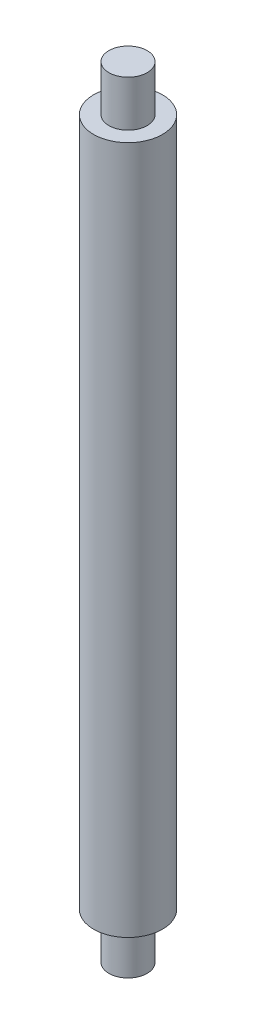
ISO-10303-21;
HEADER;
FILE_DESCRIPTION(('STEP AP214'),'2;1');
FILE_NAME('part.step','',(''),(''),'','','');
FILE_SCHEMA(('AUTOMOTIVE_DESIGN { 1 0 10303 214 1 1 1 1 }'));
ENDSEC;
DATA;
#1=APPLICATION_CONTEXT('core data for automotive mechanical design processes');
#2=APPLICATION_PROTOCOL_DEFINITION('international standard','automotive_design',2000,#1);
#3=PRODUCT_CONTEXT('',#1,'mechanical');
#4=PRODUCT('Part','Part','',(#3));
#5=PRODUCT_RELATED_PRODUCT_CATEGORY('part','',(#4));
#6=PRODUCT_DEFINITION_FORMATION('','',#4);
#7=PRODUCT_DEFINITION_CONTEXT('part definition',#1,'design');
#8=PRODUCT_DEFINITION('design','',#6,#7);
#9=PRODUCT_DEFINITION_SHAPE('','',#8);
#10=(LENGTH_UNIT() NAMED_UNIT(*) SI_UNIT(.MILLI.,.METRE.));
#11=(NAMED_UNIT(*) PLANE_ANGLE_UNIT() SI_UNIT($,.RADIAN.));
#12=(NAMED_UNIT(*) SI_UNIT($,.STERADIAN.) SOLID_ANGLE_UNIT());
#13=UNCERTAINTY_MEASURE_WITH_UNIT(LENGTH_MEASURE(1.E-05),#10,'distance_accuracy_value','');
#14=(GEOMETRIC_REPRESENTATION_CONTEXT(3) GLOBAL_UNCERTAINTY_ASSIGNED_CONTEXT((#13)) GLOBAL_UNIT_ASSIGNED_CONTEXT((#10,
#11,#12)) REPRESENTATION_CONTEXT('',''));
#15=CARTESIAN_POINT('',(0.,0.,0.));
#16=DIRECTION('',(0.,0.,1.));
#17=DIRECTION('',(1.,0.,0.));
#18=AXIS2_PLACEMENT_3D('',#15,#16,#17);
#19=CARTESIAN_POINT('',(0.,6.,0.));
#20=DIRECTION('',(0.,-1.,0.));
#21=DIRECTION('',(0.,0.,-1.));
#22=AXIS2_PLACEMENT_3D('',#19,#20,#21);
#23=CYLINDRICAL_SURFACE('',#22,2.5);
#24=CARTESIAN_POINT('',(0.,6.,0.));
#25=DIRECTION('',(0.,1.,0.));
#26=DIRECTION('',(0.,0.,1.));
#27=AXIS2_PLACEMENT_3D('',#24,#25,#26);
#28=CIRCLE('',#27,2.5);
#29=CARTESIAN_POINT('',(0.,6.,2.5));
#30=VERTEX_POINT('',#29);
#31=EDGE_CURVE('E38',#30,#30,#28,.T.);
#32=ORIENTED_EDGE('',*,*,#31,.F.);
#33=EDGE_LOOP('',(#32));
#34=FACE_BOUND('',#33,.T.);
#35=CARTESIAN_POINT('',(0.,0.,0.));
#36=DIRECTION('',(0.,1.,0.));
#37=DIRECTION('',(0.,0.,1.));
#38=AXIS2_PLACEMENT_3D('',#35,#36,#37);
#39=CIRCLE('',#38,2.5);
#40=CARTESIAN_POINT('',(0.,0.,2.5));
#41=VERTEX_POINT('',#40);
#42=EDGE_CURVE('E34',#41,#41,#39,.T.);
#43=ORIENTED_EDGE('',*,*,#42,.T.);
#44=EDGE_LOOP('',(#43));
#45=FACE_BOUND('',#44,.T.);
#46=ADVANCED_FACE('F31',(#34,#45),#23,.T.);
#47=CARTESIAN_POINT('',(0.,0.,0.));
#48=DIRECTION('',(0.,1.,0.));
#49=DIRECTION('',(0.,0.,1.));
#50=AXIS2_PLACEMENT_3D('',#47,#48,#49);
#51=PLANE('',#50);
#52=ORIENTED_EDGE('',*,*,#42,.F.);
#53=EDGE_LOOP('',(#52));
#54=FACE_BOUND('',#53,.T.);
#55=ADVANCED_FACE('F72',(#54),#51,.F.);
#56=CARTESIAN_POINT('',(0.,96.,0.));
#57=DIRECTION('',(0.,-1.,0.));
#58=DIRECTION('',(0.,0.,-1.));
#59=AXIS2_PLACEMENT_3D('',#56,#57,#58);
#60=CYLINDRICAL_SURFACE('',#59,4.5);
#61=CARTESIAN_POINT('',(0.,96.,0.));
#62=DIRECTION('',(0.,1.,0.));
#63=DIRECTION('',(0.,0.,1.));
#64=AXIS2_PLACEMENT_3D('',#61,#62,#63);
#65=CIRCLE('',#64,4.5);
#66=CARTESIAN_POINT('',(0.,96.,-4.5));
#67=VERTEX_POINT('',#66);
#68=EDGE_CURVE('E46',#67,#67,#65,.T.);
#69=CARTESIAN_POINT('',(0.,6.,0.));
#70=DIRECTION('',(0.,1.,0.));
#71=DIRECTION('',(0.,0.,1.));
#72=AXIS2_PLACEMENT_3D('',#69,#70,#71);
#73=CIRCLE('',#72,4.5);
#74=CARTESIAN_POINT('',(0.,5.99999999999999,-4.5));
#75=VERTEX_POINT('',#74);
#76=EDGE_CURVE('E49',#75,#75,#73,.T.);
#77=CARTESIAN_POINT('',(0.,96.,-4.5));
#78=CARTESIAN_POINT('',(0.,95.0625,-4.5));
#79=CARTESIAN_POINT('',(0.,94.125,-4.5));
#80=CARTESIAN_POINT('',(0.,92.25,-4.5));
#81=CARTESIAN_POINT('',(0.,91.3125,-4.5));
#82=CARTESIAN_POINT('',(0.,89.4375,-4.5));
#83=CARTESIAN_POINT('',(0.,88.5,-4.5));
#84=CARTESIAN_POINT('',(0.,86.625,-4.5));
#85=CARTESIAN_POINT('',(0.,85.6875,-4.5));
#86=CARTESIAN_POINT('',(0.,83.8125,-4.5));
#87=CARTESIAN_POINT('',(0.,82.875,-4.5));
#88=CARTESIAN_POINT('',(0.,81.,-4.5));
#89=CARTESIAN_POINT('',(0.,80.0625,-4.5));
#90=CARTESIAN_POINT('',(0.,78.1875,-4.5));
#91=CARTESIAN_POINT('',(0.,77.25,-4.5));
#92=CARTESIAN_POINT('',(0.,75.375,-4.5));
#93=CARTESIAN_POINT('',(0.,74.4375,-4.5));
#94=CARTESIAN_POINT('',(0.,72.5625,-4.5));
#95=CARTESIAN_POINT('',(0.,71.625,-4.5));
#96=CARTESIAN_POINT('',(0.,69.75,-4.5));
#97=CARTESIAN_POINT('',(0.,68.8125,-4.5));
#98=CARTESIAN_POINT('',(0.,66.9375,-4.5));
#99=CARTESIAN_POINT('',(0.,66.,-4.5));
#100=CARTESIAN_POINT('',(0.,64.125,-4.5));
#101=CARTESIAN_POINT('',(0.,63.1875,-4.5));
#102=CARTESIAN_POINT('',(0.,61.3125,-4.5));
#103=CARTESIAN_POINT('',(0.,60.375,-4.5));
#104=CARTESIAN_POINT('',(0.,58.5,-4.5));
#105=CARTESIAN_POINT('',(0.,57.5625,-4.5));
#106=CARTESIAN_POINT('',(0.,55.6875,-4.5));
#107=CARTESIAN_POINT('',(0.,54.75,-4.5));
#108=CARTESIAN_POINT('',(0.,52.875,-4.5));
#109=CARTESIAN_POINT('',(0.,51.9375,-4.5));
#110=CARTESIAN_POINT('',(0.,50.0625,-4.5));
#111=CARTESIAN_POINT('',(0.,49.125,-4.5));
#112=CARTESIAN_POINT('',(0.,47.25,-4.5));
#113=CARTESIAN_POINT('',(0.,46.3125,-4.5));
#114=CARTESIAN_POINT('',(0.,44.4375,-4.5));
#115=CARTESIAN_POINT('',(0.,43.5,-4.5));
#116=CARTESIAN_POINT('',(0.,41.625,-4.5));
#117=CARTESIAN_POINT('',(0.,40.6875,-4.5));
#118=CARTESIAN_POINT('',(0.,38.8125,-4.5));
#119=CARTESIAN_POINT('',(0.,37.875,-4.5));
#120=CARTESIAN_POINT('',(0.,36.,-4.5));
#121=CARTESIAN_POINT('',(0.,35.0625,-4.5));
#122=CARTESIAN_POINT('',(0.,33.1875,-4.5));
#123=CARTESIAN_POINT('',(0.,32.25,-4.5));
#124=CARTESIAN_POINT('',(0.,30.375,-4.5));
#125=CARTESIAN_POINT('',(0.,29.4375,-4.5));
#126=CARTESIAN_POINT('',(0.,27.5625,-4.5));
#127=CARTESIAN_POINT('',(0.,26.625,-4.5));
#128=CARTESIAN_POINT('',(0.,24.75,-4.5));
#129=CARTESIAN_POINT('',(0.,23.8125,-4.5));
#130=CARTESIAN_POINT('',(0.,21.9375,-4.5));
#131=CARTESIAN_POINT('',(0.,21.,-4.5));
#132=CARTESIAN_POINT('',(0.,19.125,-4.5));
#133=CARTESIAN_POINT('',(0.,18.1875,-4.5));
#134=CARTESIAN_POINT('',(0.,16.3125,-4.5));
#135=CARTESIAN_POINT('',(0.,15.375,-4.5));
#136=CARTESIAN_POINT('',(0.,13.5,-4.5));
#137=CARTESIAN_POINT('',(0.,12.5625,-4.5));
#138=CARTESIAN_POINT('',(0.,10.6875,-4.5));
#139=CARTESIAN_POINT('',(0.,9.74999999999999,-4.5));
#140=CARTESIAN_POINT('',(0.,7.87499999999999,-4.5));
#141=CARTESIAN_POINT('',(0.,6.93749999999999,-4.5));
#142=CARTESIAN_POINT('',(0.,5.99999999999999,-4.5));
#143=B_SPLINE_CURVE_WITH_KNOTS('',3,(#77,#78,#79,#80,#81,#82,#83,#84,#85,#86,#87,#88,#89,#90,
#91,#92,#93,#94,#95,#96,#97,#98,#99,#100,#101,#102,#103,#104,#105,#106,#107,#108,#109,#110,#111,
#112,#113,#114,#115,#116,#117,#118,#119,#120,#121,#122,#123,#124,#125,#126,#127,#128,#129,#130,
#131,#132,#133,#134,#135,#136,#137,#138,#139,#140,#141,#142),.UNSPECIFIED.,.F.,.F.,(4,2,2,2,2,2,
2,2,2,2,2,2,2,2,2,2,2,2,2,2,2,2,2,2,2,2,2,2,2,2,2,2,4),(0.,2.81250000000001,5.62500000000001,
8.43750000000001,11.25,14.0625,16.875,19.6875,22.5,25.3125,28.125,30.9375,33.75,36.5625,39.375,
42.1875,45.,47.8125,50.625,53.4375,56.25,59.0625,61.875,64.6875,67.5,70.3125,73.125,75.9375,
78.75,81.5625,84.375,87.1875,90.),.UNSPECIFIED.);
#144=EDGE_CURVE('BSEAM77',#67,#75,#143,.T.);
#145=ORIENTED_EDGE('',*,*,#68,.F.);
#146=ORIENTED_EDGE('',*,*,#76,.T.);
#147=ORIENTED_EDGE('',*,*,#144,.T.);
#148=ORIENTED_EDGE('',*,*,#144,.F.);
#149=EDGE_LOOP('',(#145,#147,#146,#148));
#150=FACE_BOUND('',#149,.T.);
#151=ADVANCED_FACE('F77',(#150),#60,.T.);
#152=CARTESIAN_POINT('',(0.,96.,0.));
#153=DIRECTION('',(0.,1.,0.));
#154=DIRECTION('',(0.,0.,1.));
#155=AXIS2_PLACEMENT_3D('',#152,#153,#154);
#156=PLANE('',#155);
#157=CARTESIAN_POINT('',(0.,96.,0.));
#158=DIRECTION('',(0.,1.,0.));
#159=DIRECTION('',(0.,0.,1.));
#160=AXIS2_PLACEMENT_3D('',#157,#158,#159);
#161=CIRCLE('',#160,2.5);
#162=CARTESIAN_POINT('',(0.,96.,2.5));
#163=VERTEX_POINT('',#162);
#164=EDGE_CURVE('E10',#163,#163,#161,.T.);
#165=ORIENTED_EDGE('',*,*,#164,.F.);
#166=EDGE_LOOP('',(#165));
#167=FACE_BOUND('',#166,.T.);
#168=ORIENTED_EDGE('',*,*,#68,.T.);
#169=EDGE_LOOP('',(#168));
#170=FACE_BOUND('',#169,.T.);
#171=ADVANCED_FACE('F67',(#167,#170),#156,.T.);
#172=CARTESIAN_POINT('',(0.,6.,0.));
#173=DIRECTION('',(0.,1.,0.));
#174=DIRECTION('',(0.,0.,1.));
#175=AXIS2_PLACEMENT_3D('',#172,#173,#174);
#176=PLANE('',#175);
#177=ORIENTED_EDGE('',*,*,#31,.T.);
#178=EDGE_LOOP('',(#177));
#179=FACE_BOUND('',#178,.T.);
#180=ORIENTED_EDGE('',*,*,#76,.F.);
#181=EDGE_LOOP('',(#180));
#182=FACE_BOUND('',#181,.T.);
#183=ADVANCED_FACE('F60',(#179,#182),#176,.F.);
#184=CARTESIAN_POINT('',(0.,102.,0.));
#185=DIRECTION('',(0.,-1.,0.));
#186=DIRECTION('',(0.,0.,-1.));
#187=AXIS2_PLACEMENT_3D('',#184,#185,#186);
#188=CYLINDRICAL_SURFACE('',#187,2.5);
#189=CARTESIAN_POINT('',(0.,102.,0.));
#190=DIRECTION('',(0.,1.,0.));
#191=DIRECTION('',(0.,0.,1.));
#192=AXIS2_PLACEMENT_3D('',#189,#190,#191);
#193=CIRCLE('',#192,2.5);
#194=CARTESIAN_POINT('',(0.,102.,2.5));
#195=VERTEX_POINT('',#194);
#196=EDGE_CURVE('E45',#195,#195,#193,.T.);
#197=ORIENTED_EDGE('',*,*,#196,.F.);
#198=EDGE_LOOP('',(#197));
#199=FACE_BOUND('',#198,.T.);
#200=ORIENTED_EDGE('',*,*,#164,.T.);
#201=EDGE_LOOP('',(#200));
#202=FACE_BOUND('',#201,.T.);
#203=ADVANCED_FACE('F58',(#199,#202),#188,.T.);
#204=CARTESIAN_POINT('',(0.,102.,0.));
#205=DIRECTION('',(0.,1.,0.));
#206=DIRECTION('',(0.,0.,1.));
#207=AXIS2_PLACEMENT_3D('',#204,#205,#206);
#208=PLANE('',#207);
#209=ORIENTED_EDGE('',*,*,#196,.T.);
#210=EDGE_LOOP('',(#209));
#211=FACE_BOUND('',#210,.T.);
#212=ADVANCED_FACE('F56',(#211),#208,.T.);
#213=CLOSED_SHELL('',(#46,#55,#151,#171,#183,#203,#212));
#214=MANIFOLD_SOLID_BREP('B2',#213);
#215=ADVANCED_BREP_SHAPE_REPRESENTATION('',(#18,#214),#14);
#216=SHAPE_DEFINITION_REPRESENTATION(#9,#215);
ENDSEC;
END-ISO-10303-21;
